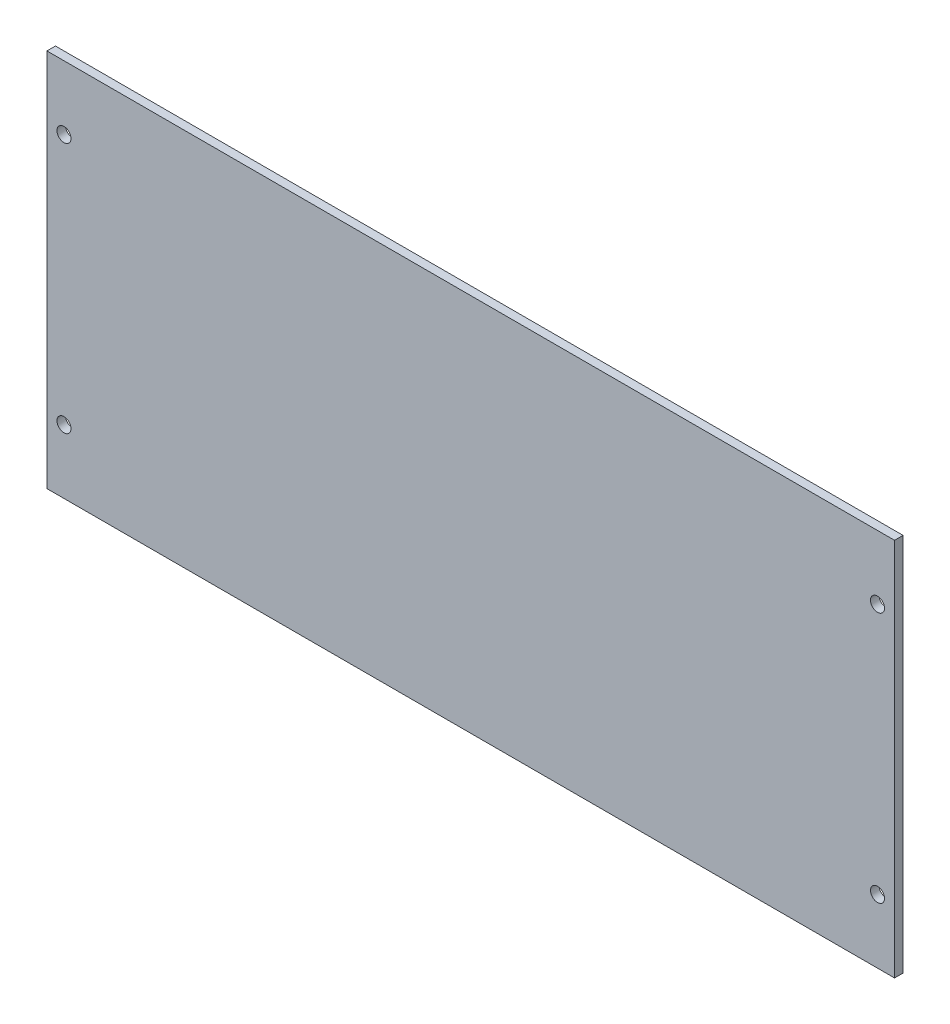
ISO-10303-21;
HEADER;
FILE_DESCRIPTION(('STEP AP214'),'2;1');
FILE_NAME('part.step','',(''),(''),'','','');
FILE_SCHEMA(('AUTOMOTIVE_DESIGN { 1 0 10303 214 1 1 1 1 }'));
ENDSEC;
DATA;
#1=APPLICATION_CONTEXT('core data for automotive mechanical design processes');
#2=APPLICATION_PROTOCOL_DEFINITION('international standard','automotive_design',2000,#1);
#3=PRODUCT_CONTEXT('',#1,'mechanical');
#4=PRODUCT('Part','Part','',(#3));
#5=PRODUCT_RELATED_PRODUCT_CATEGORY('part','',(#4));
#6=PRODUCT_DEFINITION_FORMATION('','',#4);
#7=PRODUCT_DEFINITION_CONTEXT('part definition',#1,'design');
#8=PRODUCT_DEFINITION('design','',#6,#7);
#9=PRODUCT_DEFINITION_SHAPE('','',#8);
#10=(LENGTH_UNIT() NAMED_UNIT(*) SI_UNIT(.MILLI.,.METRE.));
#11=(NAMED_UNIT(*) PLANE_ANGLE_UNIT() SI_UNIT($,.RADIAN.));
#12=(NAMED_UNIT(*) SI_UNIT($,.STERADIAN.) SOLID_ANGLE_UNIT());
#13=UNCERTAINTY_MEASURE_WITH_UNIT(LENGTH_MEASURE(1.E-05),#10,'distance_accuracy_value','');
#14=(GEOMETRIC_REPRESENTATION_CONTEXT(3) GLOBAL_UNCERTAINTY_ASSIGNED_CONTEXT((#13)) GLOBAL_UNIT_ASSIGNED_CONTEXT((#10,
#11,#12)) REPRESENTATION_CONTEXT('',''));
#15=CARTESIAN_POINT('',(0.,0.,0.));
#16=DIRECTION('',(0.,0.,1.));
#17=DIRECTION('',(1.,0.,0.));
#18=AXIS2_PLACEMENT_3D('',#15,#16,#17);
#19=CARTESIAN_POINT('',(199.,-89.,4.));
#20=DIRECTION('',(-1.,0.,0.));
#21=DIRECTION('',(0.,0.,1.));
#22=AXIS2_PLACEMENT_3D('',#19,#20,#21);
#23=PLANE('',#22);
#24=DIRECTION('',(0.,1.,0.));
#25=VECTOR('',#24,1.);
#26=CARTESIAN_POINT('',(199.,-89.,0.));
#27=LINE('',#26,#25);
#28=CARTESIAN_POINT('',(199.,-89.,0.));
#29=VERTEX_POINT('',#28);
#30=CARTESIAN_POINT('',(199.,89.,0.));
#31=VERTEX_POINT('',#30);
#32=EDGE_CURVE('E95',#29,#31,#27,.T.);
#33=ORIENTED_EDGE('',*,*,#32,.T.);
#34=DIRECTION('',(0.,0.,-1.));
#35=VECTOR('',#34,1.);
#36=CARTESIAN_POINT('',(199.,89.,4.));
#37=LINE('',#36,#35);
#38=CARTESIAN_POINT('',(199.,89.,4.));
#39=VERTEX_POINT('',#38);
#40=EDGE_CURVE('E11',#39,#31,#37,.T.);
#41=ORIENTED_EDGE('',*,*,#40,.F.);
#42=DIRECTION('',(0.,1.,0.));
#43=VECTOR('',#42,1.);
#44=CARTESIAN_POINT('',(199.,-89.,4.));
#45=LINE('',#44,#43);
#46=CARTESIAN_POINT('',(199.,-89.,4.));
#47=VERTEX_POINT('',#46);
#48=EDGE_CURVE('E83',#47,#39,#45,.T.);
#49=ORIENTED_EDGE('',*,*,#48,.F.);
#50=DIRECTION('',(0.,0.,-1.));
#51=VECTOR('',#50,1.);
#52=CARTESIAN_POINT('',(199.,-89.,4.));
#53=LINE('',#52,#51);
#54=EDGE_CURVE('E91',#47,#29,#53,.T.);
#55=ORIENTED_EDGE('',*,*,#54,.T.);
#56=EDGE_LOOP('',(#33,#41,#49,#55));
#57=FACE_BOUND('',#56,.T.);
#58=ADVANCED_FACE('F32',(#57),#23,.F.);
#59=CARTESIAN_POINT('',(-199.,89.,4.));
#60=DIRECTION('',(0.,-1.,0.));
#61=DIRECTION('',(0.,0.,-1.));
#62=AXIS2_PLACEMENT_3D('',#59,#60,#61);
#63=PLANE('',#62);
#64=DIRECTION('',(-1.,0.,0.));
#65=VECTOR('',#64,1.);
#66=CARTESIAN_POINT('',(-199.,89.,0.));
#67=LINE('',#66,#65);
#68=CARTESIAN_POINT('',(-199.,89.,0.));
#69=VERTEX_POINT('',#68);
#70=EDGE_CURVE('E87',#31,#69,#67,.T.);
#71=ORIENTED_EDGE('',*,*,#70,.T.);
#72=DIRECTION('',(0.,0.,-1.));
#73=VECTOR('',#72,1.);
#74=CARTESIAN_POINT('',(-199.,89.,4.));
#75=LINE('',#74,#73);
#76=CARTESIAN_POINT('',(-199.,89.,4.));
#77=VERTEX_POINT('',#76);
#78=EDGE_CURVE('E40',#77,#69,#75,.T.);
#79=ORIENTED_EDGE('',*,*,#78,.F.);
#80=DIRECTION('',(-1.,0.,0.));
#81=VECTOR('',#80,1.);
#82=CARTESIAN_POINT('',(-199.,89.,4.));
#83=LINE('',#82,#81);
#84=EDGE_CURVE('E78',#39,#77,#83,.T.);
#85=ORIENTED_EDGE('',*,*,#84,.F.);
#86=ORIENTED_EDGE('',*,*,#40,.T.);
#87=EDGE_LOOP('',(#71,#79,#85,#86));
#88=FACE_BOUND('',#87,.T.);
#89=ADVANCED_FACE('F86',(#88),#63,.F.);
#90=CARTESIAN_POINT('',(-199.,-89.,4.));
#91=DIRECTION('',(1.,0.,0.));
#92=DIRECTION('',(0.,0.,-1.));
#93=AXIS2_PLACEMENT_3D('',#90,#91,#92);
#94=PLANE('',#93);
#95=DIRECTION('',(0.,-1.,0.));
#96=VECTOR('',#95,1.);
#97=CARTESIAN_POINT('',(-199.,-89.,0.));
#98=LINE('',#97,#96);
#99=CARTESIAN_POINT('',(-199.,-89.,0.));
#100=VERTEX_POINT('',#99);
#101=EDGE_CURVE('E65',#69,#100,#98,.T.);
#102=ORIENTED_EDGE('',*,*,#101,.T.);
#103=DIRECTION('',(0.,0.,-1.));
#104=VECTOR('',#103,1.);
#105=CARTESIAN_POINT('',(-199.,-89.,4.));
#106=LINE('',#105,#104);
#107=CARTESIAN_POINT('',(-199.,-89.,4.));
#108=VERTEX_POINT('',#107);
#109=EDGE_CURVE('E88',#108,#100,#106,.T.);
#110=ORIENTED_EDGE('',*,*,#109,.F.);
#111=DIRECTION('',(0.,-1.,0.));
#112=VECTOR('',#111,1.);
#113=CARTESIAN_POINT('',(-199.,-89.,4.));
#114=LINE('',#113,#112);
#115=EDGE_CURVE('E81',#77,#108,#114,.T.);
#116=ORIENTED_EDGE('',*,*,#115,.F.);
#117=ORIENTED_EDGE('',*,*,#78,.T.);
#118=EDGE_LOOP('',(#102,#110,#116,#117));
#119=FACE_BOUND('',#118,.T.);
#120=ADVANCED_FACE('F89',(#119),#94,.F.);
#121=CARTESIAN_POINT('',(-199.,-89.,4.));
#122=DIRECTION('',(0.,1.,0.));
#123=DIRECTION('',(0.,0.,1.));
#124=AXIS2_PLACEMENT_3D('',#121,#122,#123);
#125=PLANE('',#124);
#126=DIRECTION('',(1.,0.,0.));
#127=VECTOR('',#126,1.);
#128=CARTESIAN_POINT('',(-199.,-89.,0.));
#129=LINE('',#128,#127);
#130=EDGE_CURVE('E71',#100,#29,#129,.T.);
#131=ORIENTED_EDGE('',*,*,#130,.T.);
#132=ORIENTED_EDGE('',*,*,#54,.F.);
#133=DIRECTION('',(1.,0.,0.));
#134=VECTOR('',#133,1.);
#135=CARTESIAN_POINT('',(-199.,-89.,4.));
#136=LINE('',#135,#134);
#137=EDGE_CURVE('E48',#108,#47,#136,.T.);
#138=ORIENTED_EDGE('',*,*,#137,.F.);
#139=ORIENTED_EDGE('',*,*,#109,.T.);
#140=EDGE_LOOP('',(#131,#132,#138,#139));
#141=FACE_BOUND('',#140,.T.);
#142=ADVANCED_FACE('F103',(#141),#125,.F.);
#143=CARTESIAN_POINT('',(0.,0.,4.));
#144=DIRECTION('',(0.,0.,-1.));
#145=DIRECTION('',(-1.,0.,0.));
#146=AXIS2_PLACEMENT_3D('',#143,#144,#145);
#147=PLANE('',#146);
#148=CARTESIAN_POINT('',(-191.,59.,4.));
#149=DIRECTION('',(0.,0.,-1.));
#150=DIRECTION('',(-1.,0.,0.));
#151=AXIS2_PLACEMENT_3D('',#148,#149,#150);
#152=CIRCLE('',#151,3.3);
#153=CARTESIAN_POINT('',(-194.3,59.,4.));
#154=VERTEX_POINT('',#153);
#155=EDGE_CURVE('E126',#154,#154,#152,.T.);
#156=ORIENTED_EDGE('',*,*,#155,.T.);
#157=EDGE_LOOP('',(#156));
#158=FACE_BOUND('',#157,.T.);
#159=CARTESIAN_POINT('',(191.,59.,4.));
#160=DIRECTION('',(0.,0.,-1.));
#161=DIRECTION('',(-1.,0.,0.));
#162=AXIS2_PLACEMENT_3D('',#159,#160,#161);
#163=CIRCLE('',#162,3.3);
#164=CARTESIAN_POINT('',(187.7,59.,4.));
#165=VERTEX_POINT('',#164);
#166=EDGE_CURVE('E120',#165,#165,#163,.T.);
#167=ORIENTED_EDGE('',*,*,#166,.T.);
#168=EDGE_LOOP('',(#167));
#169=FACE_BOUND('',#168,.T.);
#170=CARTESIAN_POINT('',(-191.,-59.,4.));
#171=DIRECTION('',(0.,0.,-1.));
#172=DIRECTION('',(-1.,0.,0.));
#173=AXIS2_PLACEMENT_3D('',#170,#171,#172);
#174=CIRCLE('',#173,3.3);
#175=CARTESIAN_POINT('',(-194.3,-59.,4.));
#176=VERTEX_POINT('',#175);
#177=EDGE_CURVE('E114',#176,#176,#174,.T.);
#178=ORIENTED_EDGE('',*,*,#177,.T.);
#179=EDGE_LOOP('',(#178));
#180=FACE_BOUND('',#179,.T.);
#181=CARTESIAN_POINT('',(191.,-59.0000000000001,4.));
#182=DIRECTION('',(0.,0.,-1.));
#183=DIRECTION('',(-1.,0.,0.));
#184=AXIS2_PLACEMENT_3D('',#181,#182,#183);
#185=CIRCLE('',#184,3.3);
#186=CARTESIAN_POINT('',(187.7,-59.0000000000001,4.));
#187=VERTEX_POINT('',#186);
#188=EDGE_CURVE('E98',#187,#187,#185,.T.);
#189=ORIENTED_EDGE('',*,*,#188,.T.);
#190=EDGE_LOOP('',(#189));
#191=FACE_BOUND('',#190,.T.);
#192=ORIENTED_EDGE('',*,*,#48,.T.);
#193=ORIENTED_EDGE('',*,*,#84,.T.);
#194=ORIENTED_EDGE('',*,*,#115,.T.);
#195=ORIENTED_EDGE('',*,*,#137,.T.);
#196=EDGE_LOOP('',(#192,#193,#194,#195));
#197=FACE_BOUND('',#196,.T.);
#198=ADVANCED_FACE('F79',(#158,#169,#180,#191,#197),#147,.F.);
#199=CARTESIAN_POINT('',(0.,0.,0.));
#200=DIRECTION('',(0.,0.,-1.));
#201=DIRECTION('',(-1.,0.,0.));
#202=AXIS2_PLACEMENT_3D('',#199,#200,#201);
#203=PLANE('',#202);
#204=CARTESIAN_POINT('',(-191.,59.,0.));
#205=DIRECTION('',(0.,0.,-1.));
#206=DIRECTION('',(-1.,0.,0.));
#207=AXIS2_PLACEMENT_3D('',#204,#205,#206);
#208=CIRCLE('',#207,3.3);
#209=CARTESIAN_POINT('',(-194.3,59.,0.));
#210=VERTEX_POINT('',#209);
#211=EDGE_CURVE('E129',#210,#210,#208,.T.);
#212=ORIENTED_EDGE('',*,*,#211,.F.);
#213=EDGE_LOOP('',(#212));
#214=FACE_BOUND('',#213,.T.);
#215=CARTESIAN_POINT('',(191.,59.,0.));
#216=DIRECTION('',(0.,0.,-1.));
#217=DIRECTION('',(-1.,0.,0.));
#218=AXIS2_PLACEMENT_3D('',#215,#216,#217);
#219=CIRCLE('',#218,3.3);
#220=CARTESIAN_POINT('',(187.7,59.,0.));
#221=VERTEX_POINT('',#220);
#222=EDGE_CURVE('E123',#221,#221,#219,.T.);
#223=ORIENTED_EDGE('',*,*,#222,.F.);
#224=EDGE_LOOP('',(#223));
#225=FACE_BOUND('',#224,.T.);
#226=CARTESIAN_POINT('',(-191.,-59.,0.));
#227=DIRECTION('',(0.,0.,-1.));
#228=DIRECTION('',(-1.,0.,0.));
#229=AXIS2_PLACEMENT_3D('',#226,#227,#228);
#230=CIRCLE('',#229,3.3);
#231=CARTESIAN_POINT('',(-194.3,-59.,0.));
#232=VERTEX_POINT('',#231);
#233=EDGE_CURVE('E117',#232,#232,#230,.T.);
#234=ORIENTED_EDGE('',*,*,#233,.F.);
#235=EDGE_LOOP('',(#234));
#236=FACE_BOUND('',#235,.T.);
#237=CARTESIAN_POINT('',(191.,-59.0000000000001,0.));
#238=DIRECTION('',(0.,0.,-1.));
#239=DIRECTION('',(-1.,0.,0.));
#240=AXIS2_PLACEMENT_3D('',#237,#238,#239);
#241=CIRCLE('',#240,3.3);
#242=CARTESIAN_POINT('',(187.7,-59.0000000000001,0.));
#243=VERTEX_POINT('',#242);
#244=EDGE_CURVE('E111',#243,#243,#241,.T.);
#245=ORIENTED_EDGE('',*,*,#244,.F.);
#246=EDGE_LOOP('',(#245));
#247=FACE_BOUND('',#246,.T.);
#248=ORIENTED_EDGE('',*,*,#32,.F.);
#249=ORIENTED_EDGE('',*,*,#130,.F.);
#250=ORIENTED_EDGE('',*,*,#101,.F.);
#251=ORIENTED_EDGE('',*,*,#70,.F.);
#252=EDGE_LOOP('',(#248,#249,#250,#251));
#253=FACE_BOUND('',#252,.T.);
#254=ADVANCED_FACE('F106',(#214,#225,#236,#247,#253),#203,.T.);
#255=CARTESIAN_POINT('',(191.,-59.0000000000001,0.));
#256=DIRECTION('',(0.,0.,-1.));
#257=DIRECTION('',(-1.,0.,0.));
#258=AXIS2_PLACEMENT_3D('',#255,#256,#257);
#259=CYLINDRICAL_SURFACE('',#258,3.3);
#260=ORIENTED_EDGE('',*,*,#188,.F.);
#261=EDGE_LOOP('',(#260));
#262=FACE_BOUND('',#261,.T.);
#263=ORIENTED_EDGE('',*,*,#244,.T.);
#264=EDGE_LOOP('',(#263));
#265=FACE_BOUND('',#264,.T.);
#266=ADVANCED_FACE('F137',(#262,#265),#259,.F.);
#267=CARTESIAN_POINT('',(-191.,-59.,0.));
#268=DIRECTION('',(0.,0.,-1.));
#269=DIRECTION('',(-1.,0.,0.));
#270=AXIS2_PLACEMENT_3D('',#267,#268,#269);
#271=CYLINDRICAL_SURFACE('',#270,3.3);
#272=ORIENTED_EDGE('',*,*,#177,.F.);
#273=EDGE_LOOP('',(#272));
#274=FACE_BOUND('',#273,.T.);
#275=ORIENTED_EDGE('',*,*,#233,.T.);
#276=EDGE_LOOP('',(#275));
#277=FACE_BOUND('',#276,.T.);
#278=ADVANCED_FACE('F146',(#274,#277),#271,.F.);
#279=CARTESIAN_POINT('',(191.,59.,0.));
#280=DIRECTION('',(0.,0.,-1.));
#281=DIRECTION('',(-1.,0.,0.));
#282=AXIS2_PLACEMENT_3D('',#279,#280,#281);
#283=CYLINDRICAL_SURFACE('',#282,3.3);
#284=ORIENTED_EDGE('',*,*,#166,.F.);
#285=EDGE_LOOP('',(#284));
#286=FACE_BOUND('',#285,.T.);
#287=ORIENTED_EDGE('',*,*,#222,.T.);
#288=EDGE_LOOP('',(#287));
#289=FACE_BOUND('',#288,.T.);
#290=ADVANCED_FACE('F152',(#286,#289),#283,.F.);
#291=CARTESIAN_POINT('',(-191.,59.,0.));
#292=DIRECTION('',(0.,0.,-1.));
#293=DIRECTION('',(-1.,0.,0.));
#294=AXIS2_PLACEMENT_3D('',#291,#292,#293);
#295=CYLINDRICAL_SURFACE('',#294,3.3);
#296=ORIENTED_EDGE('',*,*,#155,.F.);
#297=EDGE_LOOP('',(#296));
#298=FACE_BOUND('',#297,.T.);
#299=ORIENTED_EDGE('',*,*,#211,.T.);
#300=EDGE_LOOP('',(#299));
#301=FACE_BOUND('',#300,.T.);
#302=ADVANCED_FACE('F133',(#298,#301),#295,.F.);
#303=CLOSED_SHELL('',(#58,#89,#120,#142,#198,#254,#266,#278,#290,#302));
#304=MANIFOLD_SOLID_BREP('B2',#303);
#305=ADVANCED_BREP_SHAPE_REPRESENTATION('',(#18,#304),#14);
#306=SHAPE_DEFINITION_REPRESENTATION(#9,#305);
ENDSEC;
END-ISO-10303-21;
